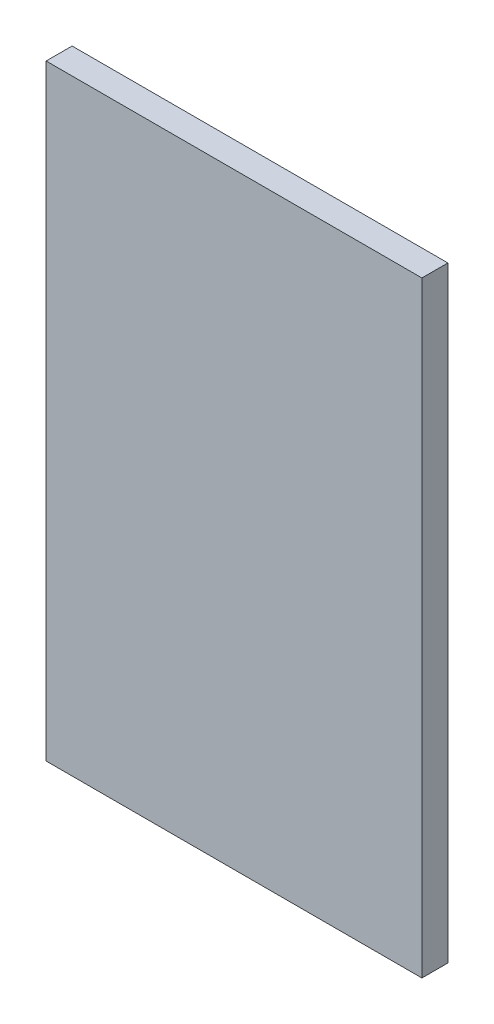
ISO-10303-21;
HEADER;
FILE_DESCRIPTION(('STEP AP214'),'2;1');
FILE_NAME('part.step','',(''),(''),'','','');
FILE_SCHEMA(('AUTOMOTIVE_DESIGN { 1 0 10303 214 1 1 1 1 }'));
ENDSEC;
DATA;
#1=APPLICATION_CONTEXT('core data for automotive mechanical design processes');
#2=APPLICATION_PROTOCOL_DEFINITION('international standard','automotive_design',2000,#1);
#3=PRODUCT_CONTEXT('',#1,'mechanical');
#4=PRODUCT('Part','Part','',(#3));
#5=PRODUCT_RELATED_PRODUCT_CATEGORY('part','',(#4));
#6=PRODUCT_DEFINITION_FORMATION('','',#4);
#7=PRODUCT_DEFINITION_CONTEXT('part definition',#1,'design');
#8=PRODUCT_DEFINITION('design','',#6,#7);
#9=PRODUCT_DEFINITION_SHAPE('','',#8);
#10=(LENGTH_UNIT() NAMED_UNIT(*) SI_UNIT(.MILLI.,.METRE.));
#11=(NAMED_UNIT(*) PLANE_ANGLE_UNIT() SI_UNIT($,.RADIAN.));
#12=(NAMED_UNIT(*) SI_UNIT($,.STERADIAN.) SOLID_ANGLE_UNIT());
#13=UNCERTAINTY_MEASURE_WITH_UNIT(LENGTH_MEASURE(1.E-05),#10,'distance_accuracy_value','');
#14=(GEOMETRIC_REPRESENTATION_CONTEXT(3) GLOBAL_UNCERTAINTY_ASSIGNED_CONTEXT((#13)) GLOBAL_UNIT_ASSIGNED_CONTEXT((#10,
#11,#12)) REPRESENTATION_CONTEXT('',''));
#15=CARTESIAN_POINT('',(0.,0.,0.));
#16=DIRECTION('',(0.,0.,1.));
#17=DIRECTION('',(1.,0.,0.));
#18=AXIS2_PLACEMENT_3D('',#15,#16,#17);
#19=CARTESIAN_POINT('',(-21.7,-35.01,3.));
#20=DIRECTION('',(1.,0.,0.));
#21=DIRECTION('',(0.,0.,-1.));
#22=AXIS2_PLACEMENT_3D('',#19,#20,#21);
#23=PLANE('',#22);
#24=DIRECTION('',(0.,-1.,0.));
#25=VECTOR('',#24,1.);
#26=CARTESIAN_POINT('',(-21.7,-35.01,0.));
#27=LINE('',#26,#25);
#28=CARTESIAN_POINT('',(-21.7,35.01,0.));
#29=VERTEX_POINT('',#28);
#30=CARTESIAN_POINT('',(-21.7,-35.01,0.));
#31=VERTEX_POINT('',#30);
#32=EDGE_CURVE('E96',#29,#31,#27,.T.);
#33=ORIENTED_EDGE('',*,*,#32,.T.);
#34=DIRECTION('',(0.,0.,-1.));
#35=VECTOR('',#34,1.);
#36=CARTESIAN_POINT('',(-21.7,-35.01,3.));
#37=LINE('',#36,#35);
#38=CARTESIAN_POINT('',(-21.7,-35.01,3.));
#39=VERTEX_POINT('',#38);
#40=EDGE_CURVE('E11',#39,#31,#37,.T.);
#41=ORIENTED_EDGE('',*,*,#40,.F.);
#42=DIRECTION('',(0.,-1.,0.));
#43=VECTOR('',#42,1.);
#44=CARTESIAN_POINT('',(-21.7,-35.01,3.));
#45=LINE('',#44,#43);
#46=CARTESIAN_POINT('',(-21.7,35.01,3.));
#47=VERTEX_POINT('',#46);
#48=EDGE_CURVE('E84',#47,#39,#45,.T.);
#49=ORIENTED_EDGE('',*,*,#48,.F.);
#50=DIRECTION('',(0.,0.,-1.));
#51=VECTOR('',#50,1.);
#52=CARTESIAN_POINT('',(-21.7,35.01,3.));
#53=LINE('',#52,#51);
#54=EDGE_CURVE('E92',#47,#29,#53,.T.);
#55=ORIENTED_EDGE('',*,*,#54,.T.);
#56=EDGE_LOOP('',(#33,#41,#49,#55));
#57=FACE_BOUND('',#56,.T.);
#58=ADVANCED_FACE('F33',(#57),#23,.F.);
#59=CARTESIAN_POINT('',(21.7,-35.01,3.));
#60=DIRECTION('',(0.,1.,0.));
#61=DIRECTION('',(-1.,0.,0.));
#62=AXIS2_PLACEMENT_3D('',#59,#60,#61);
#63=PLANE('',#62);
#64=DIRECTION('',(1.,0.,0.));
#65=VECTOR('',#64,1.);
#66=CARTESIAN_POINT('',(21.7,-35.01,0.));
#67=LINE('',#66,#65);
#68=CARTESIAN_POINT('',(21.7,-35.01,0.));
#69=VERTEX_POINT('',#68);
#70=EDGE_CURVE('E88',#31,#69,#67,.T.);
#71=ORIENTED_EDGE('',*,*,#70,.T.);
#72=DIRECTION('',(0.,0.,-1.));
#73=VECTOR('',#72,1.);
#74=CARTESIAN_POINT('',(21.7,-35.01,3.));
#75=LINE('',#74,#73);
#76=CARTESIAN_POINT('',(21.7,-35.01,3.));
#77=VERTEX_POINT('',#76);
#78=EDGE_CURVE('E41',#77,#69,#75,.T.);
#79=ORIENTED_EDGE('',*,*,#78,.F.);
#80=DIRECTION('',(1.,0.,0.));
#81=VECTOR('',#80,1.);
#82=CARTESIAN_POINT('',(21.7,-35.01,3.));
#83=LINE('',#82,#81);
#84=EDGE_CURVE('E79',#39,#77,#83,.T.);
#85=ORIENTED_EDGE('',*,*,#84,.F.);
#86=ORIENTED_EDGE('',*,*,#40,.T.);
#87=EDGE_LOOP('',(#71,#79,#85,#86));
#88=FACE_BOUND('',#87,.T.);
#89=ADVANCED_FACE('F87',(#88),#63,.F.);
#90=CARTESIAN_POINT('',(21.7,-35.01,3.));
#91=DIRECTION('',(-1.,0.,0.));
#92=DIRECTION('',(0.,0.,1.));
#93=AXIS2_PLACEMENT_3D('',#90,#91,#92);
#94=PLANE('',#93);
#95=DIRECTION('',(0.,1.,0.));
#96=VECTOR('',#95,1.);
#97=CARTESIAN_POINT('',(21.7,-35.01,0.));
#98=LINE('',#97,#96);
#99=CARTESIAN_POINT('',(21.7,35.01,0.));
#100=VERTEX_POINT('',#99);
#101=EDGE_CURVE('E66',#69,#100,#98,.T.);
#102=ORIENTED_EDGE('',*,*,#101,.T.);
#103=DIRECTION('',(0.,0.,-1.));
#104=VECTOR('',#103,1.);
#105=CARTESIAN_POINT('',(21.7,35.01,3.));
#106=LINE('',#105,#104);
#107=CARTESIAN_POINT('',(21.7,35.01,3.));
#108=VERTEX_POINT('',#107);
#109=EDGE_CURVE('E89',#108,#100,#106,.T.);
#110=ORIENTED_EDGE('',*,*,#109,.F.);
#111=DIRECTION('',(0.,1.,0.));
#112=VECTOR('',#111,1.);
#113=CARTESIAN_POINT('',(21.7,-35.01,3.));
#114=LINE('',#113,#112);
#115=EDGE_CURVE('E82',#77,#108,#114,.T.);
#116=ORIENTED_EDGE('',*,*,#115,.F.);
#117=ORIENTED_EDGE('',*,*,#78,.T.);
#118=EDGE_LOOP('',(#102,#110,#116,#117));
#119=FACE_BOUND('',#118,.T.);
#120=ADVANCED_FACE('F90',(#119),#94,.F.);
#121=CARTESIAN_POINT('',(21.7,35.01,3.));
#122=DIRECTION('',(0.,-1.,0.));
#123=DIRECTION('',(1.,0.,0.));
#124=AXIS2_PLACEMENT_3D('',#121,#122,#123);
#125=PLANE('',#124);
#126=DIRECTION('',(-1.,0.,0.));
#127=VECTOR('',#126,1.);
#128=CARTESIAN_POINT('',(21.7,35.01,0.));
#129=LINE('',#128,#127);
#130=EDGE_CURVE('E72',#100,#29,#129,.T.);
#131=ORIENTED_EDGE('',*,*,#130,.T.);
#132=ORIENTED_EDGE('',*,*,#54,.F.);
#133=DIRECTION('',(-1.,0.,0.));
#134=VECTOR('',#133,1.);
#135=CARTESIAN_POINT('',(21.7,35.01,3.));
#136=LINE('',#135,#134);
#137=EDGE_CURVE('E49',#108,#47,#136,.T.);
#138=ORIENTED_EDGE('',*,*,#137,.F.);
#139=ORIENTED_EDGE('',*,*,#109,.T.);
#140=EDGE_LOOP('',(#131,#132,#138,#139));
#141=FACE_BOUND('',#140,.T.);
#142=ADVANCED_FACE('F103',(#141),#125,.F.);
#143=CARTESIAN_POINT('',(0.,0.,3.));
#144=DIRECTION('',(0.,0.,1.));
#145=DIRECTION('',(1.,0.,0.));
#146=AXIS2_PLACEMENT_3D('',#143,#144,#145);
#147=PLANE('',#146);
#148=ORIENTED_EDGE('',*,*,#48,.T.);
#149=ORIENTED_EDGE('',*,*,#84,.T.);
#150=ORIENTED_EDGE('',*,*,#115,.T.);
#151=ORIENTED_EDGE('',*,*,#137,.T.);
#152=EDGE_LOOP('',(#148,#149,#150,#151));
#153=FACE_BOUND('',#152,.T.);
#154=ADVANCED_FACE('F80',(#153),#147,.T.);
#155=CARTESIAN_POINT('',(0.,0.,0.));
#156=DIRECTION('',(0.,0.,1.));
#157=DIRECTION('',(1.,0.,0.));
#158=AXIS2_PLACEMENT_3D('',#155,#156,#157);
#159=PLANE('',#158);
#160=ORIENTED_EDGE('',*,*,#32,.F.);
#161=ORIENTED_EDGE('',*,*,#130,.F.);
#162=ORIENTED_EDGE('',*,*,#101,.F.);
#163=ORIENTED_EDGE('',*,*,#70,.F.);
#164=EDGE_LOOP('',(#160,#161,#162,#163));
#165=FACE_BOUND('',#164,.T.);
#166=ADVANCED_FACE('F106',(#165),#159,.F.);
#167=CLOSED_SHELL('',(#58,#89,#120,#142,#154,#166));
#168=MANIFOLD_SOLID_BREP('B2',#167);
#169=ADVANCED_BREP_SHAPE_REPRESENTATION('',(#18,#168),#14);
#170=SHAPE_DEFINITION_REPRESENTATION(#9,#169);
ENDSEC;
END-ISO-10303-21;
